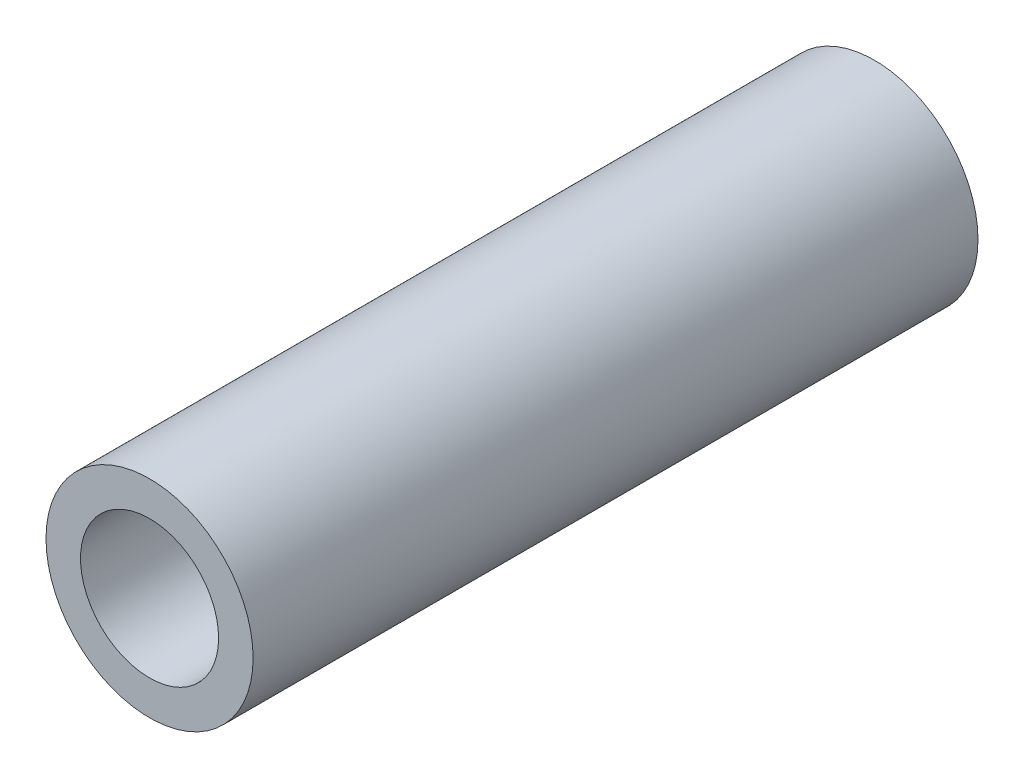
ISO-10303-21;
HEADER;
FILE_DESCRIPTION(('STEP AP214'),'2;1');
FILE_NAME('part.step','',(''),(''),'','','');
FILE_SCHEMA(('AUTOMOTIVE_DESIGN { 1 0 10303 214 1 1 1 1 }'));
ENDSEC;
DATA;
#1=APPLICATION_CONTEXT('core data for automotive mechanical design processes');
#2=APPLICATION_PROTOCOL_DEFINITION('international standard','automotive_design',2000,#1);
#3=PRODUCT_CONTEXT('',#1,'mechanical');
#4=PRODUCT('Part','Part','',(#3));
#5=PRODUCT_RELATED_PRODUCT_CATEGORY('part','',(#4));
#6=PRODUCT_DEFINITION_FORMATION('','',#4);
#7=PRODUCT_DEFINITION_CONTEXT('part definition',#1,'design');
#8=PRODUCT_DEFINITION('design','',#6,#7);
#9=PRODUCT_DEFINITION_SHAPE('','',#8);
#10=(LENGTH_UNIT() NAMED_UNIT(*) SI_UNIT(.MILLI.,.METRE.));
#11=(NAMED_UNIT(*) PLANE_ANGLE_UNIT() SI_UNIT($,.RADIAN.));
#12=(NAMED_UNIT(*) SI_UNIT($,.STERADIAN.) SOLID_ANGLE_UNIT());
#13=UNCERTAINTY_MEASURE_WITH_UNIT(LENGTH_MEASURE(1.E-05),#10,'distance_accuracy_value','');
#14=(GEOMETRIC_REPRESENTATION_CONTEXT(3) GLOBAL_UNCERTAINTY_ASSIGNED_CONTEXT((#13)) GLOBAL_UNIT_ASSIGNED_CONTEXT((#10,
#11,#12)) REPRESENTATION_CONTEXT('',''));
#15=CARTESIAN_POINT('',(0.,0.,0.));
#16=DIRECTION('',(0.,0.,1.));
#17=DIRECTION('',(1.,0.,0.));
#18=AXIS2_PLACEMENT_3D('',#15,#16,#17);
#19=CARTESIAN_POINT('',(0.,0.,63.));
#20=DIRECTION('',(0.,0.,-1.));
#21=DIRECTION('',(-1.,0.,0.));
#22=AXIS2_PLACEMENT_3D('',#19,#20,#21);
#23=CYLINDRICAL_SURFACE('',#22,6.);
#24=CARTESIAN_POINT('',(0.,0.,63.));
#25=DIRECTION('',(0.,0.,1.));
#26=DIRECTION('',(1.,0.,0.));
#27=AXIS2_PLACEMENT_3D('',#24,#25,#26);
#28=CIRCLE('',#27,6.);
#29=CARTESIAN_POINT('',(6.,0.,63.));
#30=VERTEX_POINT('',#29);
#31=EDGE_CURVE('E59',#30,#30,#28,.T.);
#32=ORIENTED_EDGE('',*,*,#31,.T.);
#33=EDGE_LOOP('',(#32));
#34=FACE_BOUND('',#33,.T.);
#35=CARTESIAN_POINT('',(0.,0.,0.));
#36=DIRECTION('',(0.,0.,1.));
#37=DIRECTION('',(1.,0.,0.));
#38=AXIS2_PLACEMENT_3D('',#35,#36,#37);
#39=CIRCLE('',#38,6.);
#40=CARTESIAN_POINT('',(6.,0.,0.));
#41=VERTEX_POINT('',#40);
#42=EDGE_CURVE('E65',#41,#41,#39,.T.);
#43=ORIENTED_EDGE('',*,*,#42,.F.);
#44=EDGE_LOOP('',(#43));
#45=FACE_BOUND('',#44,.T.);
#46=ADVANCED_FACE('F52',(#34,#45),#23,.F.);
#47=CARTESIAN_POINT('',(0.,0.,0.));
#48=DIRECTION('',(0.,0.,1.));
#49=DIRECTION('',(1.,0.,0.));
#50=AXIS2_PLACEMENT_3D('',#47,#48,#49);
#51=PLANE('',#50);
#52=ORIENTED_EDGE('',*,*,#42,.T.);
#53=EDGE_LOOP('',(#52));
#54=FACE_BOUND('',#53,.T.);
#55=CARTESIAN_POINT('',(0.,0.,0.));
#56=DIRECTION('',(0.,0.,1.));
#57=DIRECTION('',(1.,0.,0.));
#58=AXIS2_PLACEMENT_3D('',#55,#56,#57);
#59=CIRCLE('',#58,9.);
#60=CARTESIAN_POINT('',(9.,0.,0.));
#61=VERTEX_POINT('',#60);
#62=EDGE_CURVE('E55',#61,#61,#59,.T.);
#63=ORIENTED_EDGE('',*,*,#62,.F.);
#64=EDGE_LOOP('',(#63));
#65=FACE_BOUND('',#64,.T.);
#66=ADVANCED_FACE('F74',(#54,#65),#51,.F.);
#67=CARTESIAN_POINT('',(0.,0.,63.));
#68=DIRECTION('',(0.,0.,-1.));
#69=DIRECTION('',(-1.,0.,0.));
#70=AXIS2_PLACEMENT_3D('',#67,#68,#69);
#71=CYLINDRICAL_SURFACE('',#70,9.);
#72=CARTESIAN_POINT('',(0.,0.,63.));
#73=DIRECTION('',(0.,0.,1.));
#74=DIRECTION('',(1.,0.,0.));
#75=AXIS2_PLACEMENT_3D('',#72,#73,#74);
#76=CIRCLE('',#75,9.);
#77=CARTESIAN_POINT('',(9.,0.,63.));
#78=VERTEX_POINT('',#77);
#79=EDGE_CURVE('E11',#78,#78,#76,.T.);
#80=ORIENTED_EDGE('',*,*,#79,.F.);
#81=EDGE_LOOP('',(#80));
#82=FACE_BOUND('',#81,.T.);
#83=ORIENTED_EDGE('',*,*,#62,.T.);
#84=EDGE_LOOP('',(#83));
#85=FACE_BOUND('',#84,.T.);
#86=ADVANCED_FACE('F72',(#82,#85),#71,.T.);
#87=CARTESIAN_POINT('',(0.,0.,63.));
#88=DIRECTION('',(0.,0.,1.));
#89=DIRECTION('',(1.,0.,0.));
#90=AXIS2_PLACEMENT_3D('',#87,#88,#89);
#91=PLANE('',#90);
#92=ORIENTED_EDGE('',*,*,#31,.F.);
#93=EDGE_LOOP('',(#92));
#94=FACE_BOUND('',#93,.T.);
#95=ORIENTED_EDGE('',*,*,#79,.T.);
#96=EDGE_LOOP('',(#95));
#97=FACE_BOUND('',#96,.T.);
#98=ADVANCED_FACE('F81',(#94,#97),#91,.T.);
#99=CLOSED_SHELL('',(#46,#66,#86,#98));
#100=MANIFOLD_SOLID_BREP('B2',#99);
#101=ADVANCED_BREP_SHAPE_REPRESENTATION('',(#18,#100),#14);
#102=SHAPE_DEFINITION_REPRESENTATION(#9,#101);
ENDSEC;
END-ISO-10303-21;
